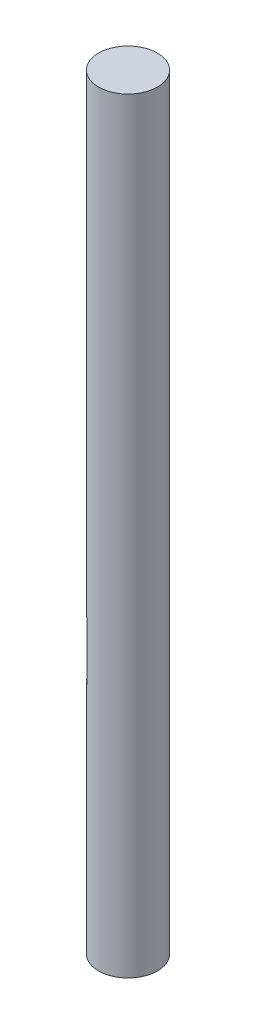
ISO-10303-21;
HEADER;
FILE_DESCRIPTION(('STEP AP214'),'2;1');
FILE_NAME('part.step','',(''),(''),'','','');
FILE_SCHEMA(('AUTOMOTIVE_DESIGN { 1 0 10303 214 1 1 1 1 }'));
ENDSEC;
DATA;
#1=APPLICATION_CONTEXT('core data for automotive mechanical design processes');
#2=APPLICATION_PROTOCOL_DEFINITION('international standard','automotive_design',2000,#1);
#3=PRODUCT_CONTEXT('',#1,'mechanical');
#4=PRODUCT('Part','Part','',(#3));
#5=PRODUCT_RELATED_PRODUCT_CATEGORY('part','',(#4));
#6=PRODUCT_DEFINITION_FORMATION('','',#4);
#7=PRODUCT_DEFINITION_CONTEXT('part definition',#1,'design');
#8=PRODUCT_DEFINITION('design','',#6,#7);
#9=PRODUCT_DEFINITION_SHAPE('','',#8);
#10=(LENGTH_UNIT() NAMED_UNIT(*) SI_UNIT(.MILLI.,.METRE.));
#11=(NAMED_UNIT(*) PLANE_ANGLE_UNIT() SI_UNIT($,.RADIAN.));
#12=(NAMED_UNIT(*) SI_UNIT($,.STERADIAN.) SOLID_ANGLE_UNIT());
#13=UNCERTAINTY_MEASURE_WITH_UNIT(LENGTH_MEASURE(1.E-05),#10,'distance_accuracy_value','');
#14=(GEOMETRIC_REPRESENTATION_CONTEXT(3) GLOBAL_UNCERTAINTY_ASSIGNED_CONTEXT((#13)) GLOBAL_UNIT_ASSIGNED_CONTEXT((#10,
#11,#12)) REPRESENTATION_CONTEXT('',''));
#15=CARTESIAN_POINT('',(0.,0.,0.));
#16=DIRECTION('',(0.,0.,1.));
#17=DIRECTION('',(1.,0.,0.));
#18=AXIS2_PLACEMENT_3D('',#15,#16,#17);
#19=CARTESIAN_POINT('',(0.,28.575,0.));
#20=DIRECTION('',(0.,-1.,0.));
#21=DIRECTION('',(0.,0.,-1.));
#22=AXIS2_PLACEMENT_3D('',#19,#20,#21);
#23=CYLINDRICAL_SURFACE('',#22,3.175);
#24=CARTESIAN_POINT('',(0.,-28.575,0.));
#25=DIRECTION('',(0.,1.,0.));
#26=DIRECTION('',(0.,0.,1.));
#27=AXIS2_PLACEMENT_3D('',#24,#25,#26);
#28=CIRCLE('',#27,3.175);
#29=CARTESIAN_POINT('',(0.,-28.575,3.175));
#30=VERTEX_POINT('',#29);
#31=EDGE_CURVE('E11',#30,#30,#28,.T.);
#32=ORIENTED_EDGE('',*,*,#31,.T.);
#33=EDGE_LOOP('',(#32));
#34=FACE_BOUND('',#33,.T.);
#35=CARTESIAN_POINT('',(0.,-3.175,0.));
#36=DIRECTION('',(0.,1.,0.));
#37=DIRECTION('',(0.,0.,1.));
#38=AXIS2_PLACEMENT_3D('',#35,#36,#37);
#39=CIRCLE('',#38,3.175);
#40=CARTESIAN_POINT('',(-1.90500000002203,-3.175,-2.54000000001042));
#41=VERTEX_POINT('',#40);
#42=CARTESIAN_POINT('',(-1.90500000002203,-3.175,2.54000000001042));
#43=VERTEX_POINT('',#42);
#44=EDGE_CURVE('E80',#41,#43,#39,.T.);
#45=ORIENTED_EDGE('',*,*,#44,.F.);
#46=DIRECTION('',(0.,1.,0.));
#47=VECTOR('',#46,1.);
#48=CARTESIAN_POINT('',(-1.90500000002203,-3.175,-2.54000000001042));
#49=LINE('',#48,#47);
#50=CARTESIAN_POINT('',(-1.90500000002203,3.175,-2.54000000001042));
#51=VERTEX_POINT('',#50);
#52=EDGE_CURVE('E51',#41,#51,#49,.T.);
#53=ORIENTED_EDGE('',*,*,#52,.T.);
#54=CARTESIAN_POINT('',(0.,3.175,0.));
#55=DIRECTION('',(0.,1.,0.));
#56=DIRECTION('',(0.,0.,1.));
#57=AXIS2_PLACEMENT_3D('',#54,#55,#56);
#58=CIRCLE('',#57,3.175);
#59=CARTESIAN_POINT('',(-1.90500000000909,3.175,2.53999999999318));
#60=VERTEX_POINT('',#59);
#61=EDGE_CURVE('E70',#51,#60,#58,.T.);
#62=ORIENTED_EDGE('',*,*,#61,.T.);
#63=DIRECTION('',(0.,1.,0.));
#64=VECTOR('',#63,1.);
#65=CARTESIAN_POINT('',(-1.90500000002203,-3.175,2.54000000001042));
#66=LINE('',#65,#64);
#67=EDGE_CURVE('E78',#43,#60,#66,.T.);
#68=ORIENTED_EDGE('',*,*,#67,.F.);
#69=EDGE_LOOP('',(#45,#53,#62,#68));
#70=FACE_BOUND('',#69,.T.);
#71=CARTESIAN_POINT('',(0.,53.975,0.));
#72=DIRECTION('',(0.,1.,0.));
#73=DIRECTION('',(0.,0.,1.));
#74=AXIS2_PLACEMENT_3D('',#71,#72,#73);
#75=CIRCLE('',#74,3.175);
#76=CARTESIAN_POINT('',(0.,53.975,3.175));
#77=VERTEX_POINT('',#76);
#78=EDGE_CURVE('E75',#77,#77,#75,.T.);
#79=ORIENTED_EDGE('',*,*,#78,.F.);
#80=EDGE_LOOP('',(#79));
#81=FACE_BOUND('',#80,.T.);
#82=ADVANCED_FACE('F43',(#34,#70,#81),#23,.T.);
#83=CARTESIAN_POINT('',(0.,-28.575,0.));
#84=DIRECTION('',(0.,1.,0.));
#85=DIRECTION('',(0.,0.,1.));
#86=AXIS2_PLACEMENT_3D('',#83,#84,#85);
#87=PLANE('',#86);
#88=ORIENTED_EDGE('',*,*,#31,.F.);
#89=EDGE_LOOP('',(#88));
#90=FACE_BOUND('',#89,.T.);
#91=ADVANCED_FACE('F99',(#90),#87,.F.);
#92=CARTESIAN_POINT('',(-1.90500000002203,-3.175,291596.5075));
#93=DIRECTION('',(1.,0.,0.));
#94=DIRECTION('',(0.,0.,-1.));
#95=AXIS2_PLACEMENT_3D('',#92,#93,#94);
#96=PLANE('',#95);
#97=DIRECTION('',(0.,0.,-1.));
#98=VECTOR('',#97,1.);
#99=CARTESIAN_POINT('',(-1.90500000002203,3.175,291596.5075));
#100=LINE('',#99,#98);
#101=EDGE_CURVE('E57',#60,#51,#100,.T.);
#102=ORIENTED_EDGE('',*,*,#101,.T.);
#103=ORIENTED_EDGE('',*,*,#52,.F.);
#104=DIRECTION('',(0.,0.,-1.));
#105=VECTOR('',#104,1.);
#106=CARTESIAN_POINT('',(-1.90500000002203,-3.175,291596.5075));
#107=LINE('',#106,#105);
#108=EDGE_CURVE('E87',#43,#41,#107,.T.);
#109=ORIENTED_EDGE('',*,*,#108,.F.);
#110=ORIENTED_EDGE('',*,*,#67,.T.);
#111=EDGE_LOOP('',(#102,#103,#109,#110));
#112=FACE_BOUND('',#111,.T.);
#113=ADVANCED_FACE('F77',(#112),#96,.F.);
#114=CARTESIAN_POINT('',(0.,-3.175,0.));
#115=DIRECTION('',(0.,1.,0.));
#116=DIRECTION('',(0.,0.,1.));
#117=AXIS2_PLACEMENT_3D('',#114,#115,#116);
#118=PLANE('',#117);
#119=ORIENTED_EDGE('',*,*,#44,.T.);
#120=ORIENTED_EDGE('',*,*,#108,.T.);
#121=EDGE_LOOP('',(#119,#120));
#122=FACE_BOUND('',#121,.T.);
#123=ADVANCED_FACE('F111',(#122),#118,.T.);
#124=CARTESIAN_POINT('',(0.,3.175,0.));
#125=DIRECTION('',(0.,1.,0.));
#126=DIRECTION('',(0.,0.,1.));
#127=AXIS2_PLACEMENT_3D('',#124,#125,#126);
#128=PLANE('',#127);
#129=ORIENTED_EDGE('',*,*,#61,.F.);
#130=ORIENTED_EDGE('',*,*,#101,.F.);
#131=EDGE_LOOP('',(#129,#130));
#132=FACE_BOUND('',#131,.T.);
#133=ADVANCED_FACE('F71',(#132),#128,.F.);
#134=CARTESIAN_POINT('',(0.,53.975,0.));
#135=DIRECTION('',(0.,1.,0.));
#136=DIRECTION('',(0.,0.,1.));
#137=AXIS2_PLACEMENT_3D('',#134,#135,#136);
#138=PLANE('',#137);
#139=ORIENTED_EDGE('',*,*,#78,.T.);
#140=EDGE_LOOP('',(#139));
#141=FACE_BOUND('',#140,.T.);
#142=ADVANCED_FACE('F97',(#141),#138,.T.);
#143=CLOSED_SHELL('',(#82,#91,#113,#123,#133,#142));
#144=MANIFOLD_SOLID_BREP('B2',#143);
#145=ADVANCED_BREP_SHAPE_REPRESENTATION('',(#18,#144),#14);
#146=SHAPE_DEFINITION_REPRESENTATION(#9,#145);
ENDSEC;
END-ISO-10303-21;
